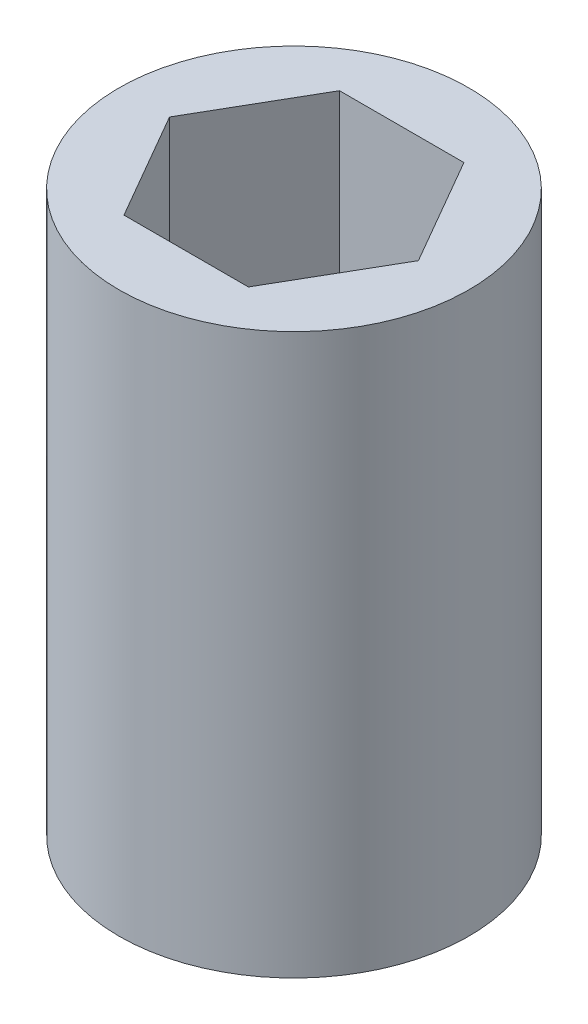
ISO-10303-21;
HEADER;
FILE_DESCRIPTION(('STEP AP214'),'2;1');
FILE_NAME('part.step','',(''),(''),'','','');
FILE_SCHEMA(('AUTOMOTIVE_DESIGN { 1 0 10303 214 1 1 1 1 }'));
ENDSEC;
DATA;
#1=APPLICATION_CONTEXT('core data for automotive mechanical design processes');
#2=APPLICATION_PROTOCOL_DEFINITION('international standard','automotive_design',2000,#1);
#3=PRODUCT_CONTEXT('',#1,'mechanical');
#4=PRODUCT('Part','Part','',(#3));
#5=PRODUCT_RELATED_PRODUCT_CATEGORY('part','',(#4));
#6=PRODUCT_DEFINITION_FORMATION('','',#4);
#7=PRODUCT_DEFINITION_CONTEXT('part definition',#1,'design');
#8=PRODUCT_DEFINITION('design','',#6,#7);
#9=PRODUCT_DEFINITION_SHAPE('','',#8);
#10=(LENGTH_UNIT() NAMED_UNIT(*) SI_UNIT(.MILLI.,.METRE.));
#11=(NAMED_UNIT(*) PLANE_ANGLE_UNIT() SI_UNIT($,.RADIAN.));
#12=(NAMED_UNIT(*) SI_UNIT($,.STERADIAN.) SOLID_ANGLE_UNIT());
#13=UNCERTAINTY_MEASURE_WITH_UNIT(LENGTH_MEASURE(1.E-05),#10,'distance_accuracy_value','');
#14=(GEOMETRIC_REPRESENTATION_CONTEXT(3) GLOBAL_UNCERTAINTY_ASSIGNED_CONTEXT((#13)) GLOBAL_UNIT_ASSIGNED_CONTEXT((#10,
#11,#12)) REPRESENTATION_CONTEXT('',''));
#15=CARTESIAN_POINT('',(0.,0.,0.));
#16=DIRECTION('',(0.,0.,1.));
#17=DIRECTION('',(1.,0.,0.));
#18=AXIS2_PLACEMENT_3D('',#15,#16,#17);
#19=CARTESIAN_POINT('',(0.,25.4,0.));
#20=DIRECTION('',(0.,1.,0.));
#21=DIRECTION('',(0.,0.,1.));
#22=AXIS2_PLACEMENT_3D('',#19,#20,#21);
#23=PLANE('',#22);
#24=CARTESIAN_POINT('',(0.,25.4,0.));
#25=DIRECTION('',(0.,1.,0.));
#26=DIRECTION('',(0.,0.,1.));
#27=AXIS2_PLACEMENT_3D('',#24,#25,#26);
#28=CIRCLE('',#27,7.9375);
#29=CARTESIAN_POINT('',(0.,25.4,7.9375));
#30=VERTEX_POINT('',#29);
#31=EDGE_CURVE('E11',#30,#30,#28,.T.);
#32=ORIENTED_EDGE('',*,*,#31,.T.);
#33=EDGE_LOOP('',(#32));
#34=FACE_BOUND('',#33,.T.);
#35=DIRECTION('',(-0.5,0.,-0.866025403784439));
#36=VECTOR('',#35,1.);
#37=CARTESIAN_POINT('',(5.64590828240535,25.4,0.));
#38=LINE('',#37,#36);
#39=CARTESIAN_POINT('',(5.64590828240535,25.4,0.));
#40=VERTEX_POINT('',#39);
#41=CARTESIAN_POINT('',(2.82295414120267,25.4,-4.8895));
#42=VERTEX_POINT('',#41);
#43=EDGE_CURVE('E98',#40,#42,#38,.T.);
#44=ORIENTED_EDGE('',*,*,#43,.F.);
#45=DIRECTION('',(0.5,0.,-0.866025403784439));
#46=VECTOR('',#45,1.);
#47=CARTESIAN_POINT('',(2.82295414120267,25.4,4.8895));
#48=LINE('',#47,#46);
#49=CARTESIAN_POINT('',(2.82295414120267,25.4,4.8895));
#50=VERTEX_POINT('',#49);
#51=EDGE_CURVE('E90',#50,#40,#48,.T.);
#52=ORIENTED_EDGE('',*,*,#51,.F.);
#53=DIRECTION('',(1.,0.,0.));
#54=VECTOR('',#53,1.);
#55=CARTESIAN_POINT('',(-2.82295414120267,25.4,4.8895));
#56=LINE('',#55,#54);
#57=CARTESIAN_POINT('',(-2.82295414120267,25.4,4.8895));
#58=VERTEX_POINT('',#57);
#59=EDGE_CURVE('E118',#58,#50,#56,.T.);
#60=ORIENTED_EDGE('',*,*,#59,.F.);
#61=DIRECTION('',(0.5,0.,0.866025403784438));
#62=VECTOR('',#61,1.);
#63=CARTESIAN_POINT('',(-5.64590828240535,25.4,0.));
#64=LINE('',#63,#62);
#65=CARTESIAN_POINT('',(-5.64590828240535,25.4,0.));
#66=VERTEX_POINT('',#65);
#67=EDGE_CURVE('E116',#66,#58,#64,.T.);
#68=ORIENTED_EDGE('',*,*,#67,.F.);
#69=DIRECTION('',(-0.5,0.,0.866025403784439));
#70=VECTOR('',#69,1.);
#71=CARTESIAN_POINT('',(-2.82295414120267,25.4,-4.8895));
#72=LINE('',#71,#70);
#73=CARTESIAN_POINT('',(-2.82295414120267,25.4,-4.8895));
#74=VERTEX_POINT('',#73);
#75=EDGE_CURVE('E112',#74,#66,#72,.T.);
#76=ORIENTED_EDGE('',*,*,#75,.F.);
#77=DIRECTION('',(-1.,0.,0.));
#78=VECTOR('',#77,1.);
#79=CARTESIAN_POINT('',(2.82295414120267,25.4,-4.8895));
#80=LINE('',#79,#78);
#81=EDGE_CURVE('E110',#42,#74,#80,.T.);
#82=ORIENTED_EDGE('',*,*,#81,.F.);
#83=EDGE_LOOP('',(#44,#52,#60,#68,#76,#82));
#84=FACE_BOUND('',#83,.T.);
#85=ADVANCED_FACE('F37',(#34,#84),#23,.T.);
#86=CARTESIAN_POINT('',(0.,0.,0.));
#87=DIRECTION('',(0.,1.,0.));
#88=DIRECTION('',(0.,0.,1.));
#89=AXIS2_PLACEMENT_3D('',#86,#87,#88);
#90=PLANE('',#89);
#91=CARTESIAN_POINT('',(0.,0.,0.));
#92=DIRECTION('',(0.,1.,0.));
#93=DIRECTION('',(0.,0.,1.));
#94=AXIS2_PLACEMENT_3D('',#91,#92,#93);
#95=CIRCLE('',#94,7.9375);
#96=CARTESIAN_POINT('',(0.,0.,7.9375));
#97=VERTEX_POINT('',#96);
#98=EDGE_CURVE('E41',#97,#97,#95,.T.);
#99=ORIENTED_EDGE('',*,*,#98,.F.);
#100=EDGE_LOOP('',(#99));
#101=FACE_BOUND('',#100,.T.);
#102=DIRECTION('',(0.5,0.,-0.866025403784439));
#103=VECTOR('',#102,1.);
#104=CARTESIAN_POINT('',(2.82295414120267,0.,4.8895));
#105=LINE('',#104,#103);
#106=CARTESIAN_POINT('',(2.82295414120267,0.,4.8895));
#107=VERTEX_POINT('',#106);
#108=CARTESIAN_POINT('',(5.64590828240535,0.,0.));
#109=VERTEX_POINT('',#108);
#110=EDGE_CURVE('E60',#107,#109,#105,.T.);
#111=ORIENTED_EDGE('',*,*,#110,.T.);
#112=DIRECTION('',(-0.5,0.,-0.866025403784439));
#113=VECTOR('',#112,1.);
#114=CARTESIAN_POINT('',(5.64590828240535,0.,0.));
#115=LINE('',#114,#113);
#116=CARTESIAN_POINT('',(2.82295414120267,0.,-4.8895));
#117=VERTEX_POINT('',#116);
#118=EDGE_CURVE('E105',#109,#117,#115,.T.);
#119=ORIENTED_EDGE('',*,*,#118,.T.);
#120=DIRECTION('',(-1.,0.,0.));
#121=VECTOR('',#120,1.);
#122=CARTESIAN_POINT('',(2.82295414120267,0.,-4.8895));
#123=LINE('',#122,#121);
#124=CARTESIAN_POINT('',(-2.82295414120267,0.,-4.8895));
#125=VERTEX_POINT('',#124);
#126=EDGE_CURVE('E122',#117,#125,#123,.T.);
#127=ORIENTED_EDGE('',*,*,#126,.T.);
#128=DIRECTION('',(-0.5,0.,0.866025403784439));
#129=VECTOR('',#128,1.);
#130=CARTESIAN_POINT('',(-2.82295414120267,0.,-4.8895));
#131=LINE('',#130,#129);
#132=CARTESIAN_POINT('',(-5.64590828240535,0.,0.));
#133=VERTEX_POINT('',#132);
#134=EDGE_CURVE('E125',#125,#133,#131,.T.);
#135=ORIENTED_EDGE('',*,*,#134,.T.);
#136=DIRECTION('',(0.5,0.,0.866025403784438));
#137=VECTOR('',#136,1.);
#138=CARTESIAN_POINT('',(-5.64590828240535,0.,0.));
#139=LINE('',#138,#137);
#140=CARTESIAN_POINT('',(-2.82295414120267,0.,4.8895));
#141=VERTEX_POINT('',#140);
#142=EDGE_CURVE('E128',#133,#141,#139,.T.);
#143=ORIENTED_EDGE('',*,*,#142,.T.);
#144=DIRECTION('',(1.,0.,0.));
#145=VECTOR('',#144,1.);
#146=CARTESIAN_POINT('',(-2.82295414120267,0.,4.8895));
#147=LINE('',#146,#145);
#148=EDGE_CURVE('E99',#141,#107,#147,.T.);
#149=ORIENTED_EDGE('',*,*,#148,.T.);
#150=EDGE_LOOP('',(#111,#119,#127,#135,#143,#149));
#151=FACE_BOUND('',#150,.T.);
#152=ADVANCED_FACE('F145',(#101,#151),#90,.F.);
#153=CARTESIAN_POINT('',(0.,25.4,0.));
#154=DIRECTION('',(0.,-1.,0.));
#155=DIRECTION('',(0.,0.,-1.));
#156=AXIS2_PLACEMENT_3D('',#153,#154,#155);
#157=CYLINDRICAL_SURFACE('',#156,7.9375);
#158=ORIENTED_EDGE('',*,*,#31,.F.);
#159=EDGE_LOOP('',(#158));
#160=FACE_BOUND('',#159,.T.);
#161=ORIENTED_EDGE('',*,*,#98,.T.);
#162=EDGE_LOOP('',(#161));
#163=FACE_BOUND('',#162,.T.);
#164=ADVANCED_FACE('F39',(#160,#163),#157,.T.);
#165=CARTESIAN_POINT('',(2.82295414120267,25.4,4.8895));
#166=DIRECTION('',(-0.866025403784439,0.,-0.5));
#167=DIRECTION('',(-0.5,0.,0.866025403784439));
#168=AXIS2_PLACEMENT_3D('',#165,#166,#167);
#169=PLANE('',#168);
#170=ORIENTED_EDGE('',*,*,#110,.F.);
#171=DIRECTION('',(0.,-1.,0.));
#172=VECTOR('',#171,1.);
#173=CARTESIAN_POINT('',(2.82295414120267,25.4,4.8895));
#174=LINE('',#173,#172);
#175=EDGE_CURVE('E94',#50,#107,#174,.T.);
#176=ORIENTED_EDGE('',*,*,#175,.F.);
#177=ORIENTED_EDGE('',*,*,#51,.T.);
#178=DIRECTION('',(0.,-1.,0.));
#179=VECTOR('',#178,1.);
#180=CARTESIAN_POINT('',(5.64590828240535,25.4,0.));
#181=LINE('',#180,#179);
#182=EDGE_CURVE('E93',#40,#109,#181,.T.);
#183=ORIENTED_EDGE('',*,*,#182,.T.);
#184=EDGE_LOOP('',(#170,#176,#177,#183));
#185=FACE_BOUND('',#184,.T.);
#186=ADVANCED_FACE('F92',(#185),#169,.T.);
#187=CARTESIAN_POINT('',(5.64590828240535,25.4,0.));
#188=DIRECTION('',(-0.866025403784439,0.,0.5));
#189=DIRECTION('',(0.5,0.,0.866025403784439));
#190=AXIS2_PLACEMENT_3D('',#187,#188,#189);
#191=PLANE('',#190);
#192=ORIENTED_EDGE('',*,*,#118,.F.);
#193=ORIENTED_EDGE('',*,*,#182,.F.);
#194=ORIENTED_EDGE('',*,*,#43,.T.);
#195=DIRECTION('',(0.,-1.,0.));
#196=VECTOR('',#195,1.);
#197=CARTESIAN_POINT('',(2.82295414120267,25.4,-4.8895));
#198=LINE('',#197,#196);
#199=EDGE_CURVE('E106',#42,#117,#198,.T.);
#200=ORIENTED_EDGE('',*,*,#199,.T.);
#201=EDGE_LOOP('',(#192,#193,#194,#200));
#202=FACE_BOUND('',#201,.T.);
#203=ADVANCED_FACE('F102',(#202),#191,.T.);
#204=CARTESIAN_POINT('',(2.82295414120267,25.4,-4.8895));
#205=DIRECTION('',(0.,0.,1.));
#206=DIRECTION('',(1.,0.,0.));
#207=AXIS2_PLACEMENT_3D('',#204,#205,#206);
#208=PLANE('',#207);
#209=ORIENTED_EDGE('',*,*,#126,.F.);
#210=ORIENTED_EDGE('',*,*,#199,.F.);
#211=ORIENTED_EDGE('',*,*,#81,.T.);
#212=DIRECTION('',(0.,-1.,0.));
#213=VECTOR('',#212,1.);
#214=CARTESIAN_POINT('',(-2.82295414120267,25.4,-4.8895));
#215=LINE('',#214,#213);
#216=EDGE_CURVE('E137',#74,#125,#215,.T.);
#217=ORIENTED_EDGE('',*,*,#216,.T.);
#218=EDGE_LOOP('',(#209,#210,#211,#217));
#219=FACE_BOUND('',#218,.T.);
#220=ADVANCED_FACE('F141',(#219),#208,.T.);
#221=CARTESIAN_POINT('',(-2.82295414120267,25.4,-4.8895));
#222=DIRECTION('',(0.866025403784439,0.,0.5));
#223=DIRECTION('',(0.5,0.,-0.866025403784439));
#224=AXIS2_PLACEMENT_3D('',#221,#222,#223);
#225=PLANE('',#224);
#226=ORIENTED_EDGE('',*,*,#134,.F.);
#227=ORIENTED_EDGE('',*,*,#216,.F.);
#228=ORIENTED_EDGE('',*,*,#75,.T.);
#229=DIRECTION('',(0.,-1.,0.));
#230=VECTOR('',#229,1.);
#231=CARTESIAN_POINT('',(-5.64590828240535,25.4,0.));
#232=LINE('',#231,#230);
#233=EDGE_CURVE('E135',#66,#133,#232,.T.);
#234=ORIENTED_EDGE('',*,*,#233,.T.);
#235=EDGE_LOOP('',(#226,#227,#228,#234));
#236=FACE_BOUND('',#235,.T.);
#237=ADVANCED_FACE('F153',(#236),#225,.T.);
#238=CARTESIAN_POINT('',(-5.64590828240535,25.4,0.));
#239=DIRECTION('',(0.866025403784438,0.,-0.5));
#240=DIRECTION('',(-0.5,0.,-0.866025403784438));
#241=AXIS2_PLACEMENT_3D('',#238,#239,#240);
#242=PLANE('',#241);
#243=ORIENTED_EDGE('',*,*,#142,.F.);
#244=ORIENTED_EDGE('',*,*,#233,.F.);
#245=ORIENTED_EDGE('',*,*,#67,.T.);
#246=DIRECTION('',(0.,-1.,0.));
#247=VECTOR('',#246,1.);
#248=CARTESIAN_POINT('',(-2.82295414120267,25.4,4.8895));
#249=LINE('',#248,#247);
#250=EDGE_CURVE('E52',#58,#141,#249,.T.);
#251=ORIENTED_EDGE('',*,*,#250,.T.);
#252=EDGE_LOOP('',(#243,#244,#245,#251));
#253=FACE_BOUND('',#252,.T.);
#254=ADVANCED_FACE('F151',(#253),#242,.T.);
#255=CARTESIAN_POINT('',(-2.82295414120267,25.4,4.8895));
#256=DIRECTION('',(0.,0.,-1.));
#257=DIRECTION('',(-1.,0.,0.));
#258=AXIS2_PLACEMENT_3D('',#255,#256,#257);
#259=PLANE('',#258);
#260=ORIENTED_EDGE('',*,*,#148,.F.);
#261=ORIENTED_EDGE('',*,*,#250,.F.);
#262=ORIENTED_EDGE('',*,*,#59,.T.);
#263=ORIENTED_EDGE('',*,*,#175,.T.);
#264=EDGE_LOOP('',(#260,#261,#262,#263));
#265=FACE_BOUND('',#264,.T.);
#266=ADVANCED_FACE('F147',(#265),#259,.T.);
#267=CLOSED_SHELL('',(#85,#152,#164,#186,#203,#220,#237,#254,#266));
#268=MANIFOLD_SOLID_BREP('B2',#267);
#269=ADVANCED_BREP_SHAPE_REPRESENTATION('',(#18,#268),#14);
#270=SHAPE_DEFINITION_REPRESENTATION(#9,#269);
ENDSEC;
END-ISO-10303-21;
